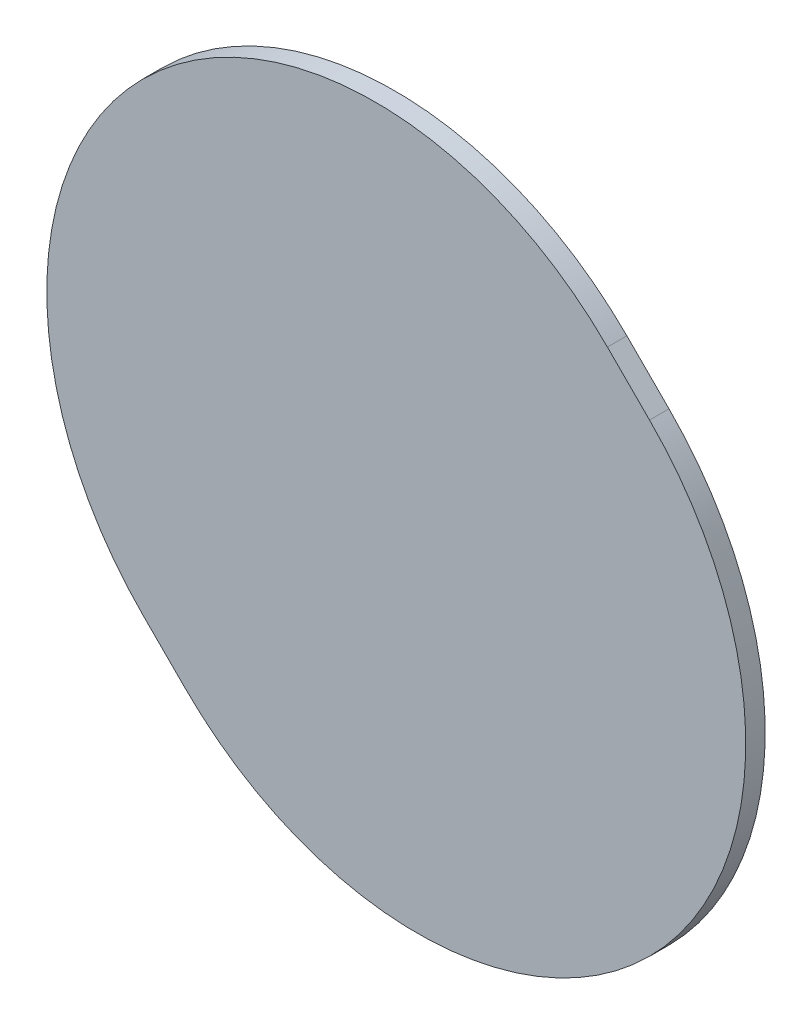
ISO-10303-21;
HEADER;
FILE_DESCRIPTION(('STEP AP214'),'2;1');
FILE_NAME('part.step','',(''),(''),'','','');
FILE_SCHEMA(('AUTOMOTIVE_DESIGN { 1 0 10303 214 1 1 1 1 }'));
ENDSEC;
DATA;
#1=APPLICATION_CONTEXT('core data for automotive mechanical design processes');
#2=APPLICATION_PROTOCOL_DEFINITION('international standard','automotive_design',2000,#1);
#3=PRODUCT_CONTEXT('',#1,'mechanical');
#4=PRODUCT('Part','Part','',(#3));
#5=PRODUCT_RELATED_PRODUCT_CATEGORY('part','',(#4));
#6=PRODUCT_DEFINITION_FORMATION('','',#4);
#7=PRODUCT_DEFINITION_CONTEXT('part definition',#1,'design');
#8=PRODUCT_DEFINITION('design','',#6,#7);
#9=PRODUCT_DEFINITION_SHAPE('','',#8);
#10=(LENGTH_UNIT() NAMED_UNIT(*) SI_UNIT(.MILLI.,.METRE.));
#11=(NAMED_UNIT(*) PLANE_ANGLE_UNIT() SI_UNIT($,.RADIAN.));
#12=(NAMED_UNIT(*) SI_UNIT($,.STERADIAN.) SOLID_ANGLE_UNIT());
#13=UNCERTAINTY_MEASURE_WITH_UNIT(LENGTH_MEASURE(1.E-05),#10,'distance_accuracy_value','');
#14=(GEOMETRIC_REPRESENTATION_CONTEXT(3) GLOBAL_UNCERTAINTY_ASSIGNED_CONTEXT((#13)) GLOBAL_UNIT_ASSIGNED_CONTEXT((#10,
#11,#12)) REPRESENTATION_CONTEXT('',''));
#15=CARTESIAN_POINT('',(0.,0.,0.));
#16=DIRECTION('',(0.,0.,1.));
#17=DIRECTION('',(1.,0.,0.));
#18=AXIS2_PLACEMENT_3D('',#15,#16,#17);
#19=CARTESIAN_POINT('',(85.20873992,114.10875578,0.));
#20=DIRECTION('',(0.707106781186613,0.707106781186482,0.));
#21=DIRECTION('',(0.707106781186482,-0.707106781186613,0.));
#22=AXIS2_PLACEMENT_3D('',#19,#20,#21);
#23=PLANE('',#22);
#24=DIRECTION('',(0.707106781186482,-0.707106781186613,0.));
#25=VECTOR('',#24,1.);
#26=CARTESIAN_POINT('',(85.20873992,114.10875578,0.03556));
#27=LINE('',#26,#25);
#28=CARTESIAN_POINT('',(85.20873992,114.10875578,0.03556));
#29=VERTEX_POINT('',#28);
#30=CARTESIAN_POINT('',(85.28575018,114.03174552,0.03556));
#31=VERTEX_POINT('',#30);
#32=EDGE_CURVE('E11',#29,#31,#27,.T.);
#33=ORIENTED_EDGE('',*,*,#32,.F.);
#34=DIRECTION('',(0.,0.,1.));
#35=VECTOR('',#34,1.);
#36=CARTESIAN_POINT('',(85.20873992,114.10875578,0.));
#37=LINE('',#36,#35);
#38=CARTESIAN_POINT('',(85.20873992,114.10875578,0.));
#39=VERTEX_POINT('',#38);
#40=EDGE_CURVE('E24',#39,#29,#37,.T.);
#41=ORIENTED_EDGE('',*,*,#40,.F.);
#42=DIRECTION('',(0.707106781186482,-0.707106781186613,0.));
#43=VECTOR('',#42,1.);
#44=CARTESIAN_POINT('',(85.20873992,114.10875578,0.));
#45=LINE('',#44,#43);
#46=CARTESIAN_POINT('',(85.28575018,114.03174552,0.));
#47=VERTEX_POINT('',#46);
#48=EDGE_CURVE('E75',#39,#47,#45,.T.);
#49=ORIENTED_EDGE('',*,*,#48,.T.);
#50=DIRECTION('',(0.,0.,1.));
#51=VECTOR('',#50,1.);
#52=CARTESIAN_POINT('',(85.28575018,114.03174552,0.));
#53=LINE('',#52,#51);
#54=EDGE_CURVE('E37',#47,#31,#53,.T.);
#55=ORIENTED_EDGE('',*,*,#54,.T.);
#56=EDGE_LOOP('',(#33,#41,#49,#55));
#57=FACE_BOUND('',#56,.T.);
#58=ADVANCED_FACE('F17',(#57),#23,.F.);
#59=CARTESIAN_POINT('',(85.71001273,114.45600807,0.));
#60=DIRECTION('',(0.,0.,-1.));
#61=DIRECTION('',(-0.707106781186548,-0.707106781186548,0.));
#62=AXIS2_PLACEMENT_3D('',#59,#60,#61);
#63=CYLINDRICAL_SURFACE('',#62,0.599997852216992);
#64=CARTESIAN_POINT('',(85.71001273,114.45600807,0.03556));
#65=DIRECTION('',(0.,0.,1.));
#66=DIRECTION('',(-0.707106781186548,-0.707106781186548,0.));
#67=AXIS2_PLACEMENT_3D('',#64,#65,#66);
#68=CIRCLE('',#67,0.599997852216992);
#69=CARTESIAN_POINT('',(86.13427528,114.88027062,0.03556));
#70=VERTEX_POINT('',#69);
#71=EDGE_CURVE('E83',#31,#70,#68,.T.);
#72=ORIENTED_EDGE('',*,*,#71,.F.);
#73=ORIENTED_EDGE('',*,*,#54,.F.);
#74=CARTESIAN_POINT('',(85.71001273,114.45600807,0.));
#75=DIRECTION('',(0.,0.,1.));
#76=DIRECTION('',(-0.707106781186548,-0.707106781186548,0.));
#77=AXIS2_PLACEMENT_3D('',#74,#75,#76);
#78=CIRCLE('',#77,0.599997852216992);
#79=CARTESIAN_POINT('',(86.13427528,114.88027062,0.));
#80=VERTEX_POINT('',#79);
#81=EDGE_CURVE('E81',#47,#80,#78,.T.);
#82=ORIENTED_EDGE('',*,*,#81,.T.);
#83=DIRECTION('',(0.,0.,1.));
#84=VECTOR('',#83,1.);
#85=CARTESIAN_POINT('',(86.13427528,114.88027062,0.));
#86=LINE('',#85,#84);
#87=EDGE_CURVE('E67',#80,#70,#86,.T.);
#88=ORIENTED_EDGE('',*,*,#87,.T.);
#89=EDGE_LOOP('',(#72,#73,#82,#88));
#90=FACE_BOUND('',#89,.T.);
#91=ADVANCED_FACE('F89',(#90),#63,.T.);
#92=CARTESIAN_POINT('',(86.13427528,114.88027062,0.));
#93=DIRECTION('',(-0.707106781186548,-0.707106781186548,0.));
#94=DIRECTION('',(-0.707106781186548,0.707106781186548,0.));
#95=AXIS2_PLACEMENT_3D('',#92,#93,#94);
#96=PLANE('',#95);
#97=DIRECTION('',(-0.707106781186548,0.707106781186548,0.));
#98=VECTOR('',#97,1.);
#99=CARTESIAN_POINT('',(86.13427528,114.88027062,0.03556));
#100=LINE('',#99,#98);
#101=CARTESIAN_POINT('',(86.05726502,114.95728088,0.03556));
#102=VERTEX_POINT('',#101);
#103=EDGE_CURVE('E71',#70,#102,#100,.T.);
#104=ORIENTED_EDGE('',*,*,#103,.F.);
#105=ORIENTED_EDGE('',*,*,#87,.F.);
#106=DIRECTION('',(-0.707106781186548,0.707106781186548,0.));
#107=VECTOR('',#106,1.);
#108=CARTESIAN_POINT('',(86.13427528,114.88027062,0.));
#109=LINE('',#108,#107);
#110=CARTESIAN_POINT('',(86.05726502,114.95728088,0.));
#111=VERTEX_POINT('',#110);
#112=EDGE_CURVE('E63',#80,#111,#109,.T.);
#113=ORIENTED_EDGE('',*,*,#112,.T.);
#114=DIRECTION('',(0.,0.,1.));
#115=VECTOR('',#114,1.);
#116=CARTESIAN_POINT('',(86.05726502,114.95728088,0.));
#117=LINE('',#116,#115);
#118=EDGE_CURVE('E53',#111,#102,#117,.T.);
#119=ORIENTED_EDGE('',*,*,#118,.T.);
#120=EDGE_LOOP('',(#104,#105,#113,#119));
#121=FACE_BOUND('',#120,.T.);
#122=ADVANCED_FACE('F66',(#121),#96,.F.);
#123=CARTESIAN_POINT('',(85.63300247,114.53301833,0.));
#124=DIRECTION('',(0.,0.,-1.));
#125=DIRECTION('',(0.707106781186548,0.707106781186548,0.));
#126=AXIS2_PLACEMENT_3D('',#123,#124,#125);
#127=CYLINDRICAL_SURFACE('',#126,0.599997852216986);
#128=CARTESIAN_POINT('',(85.63300247,114.53301833,0.03556));
#129=DIRECTION('',(0.,0.,1.));
#130=DIRECTION('',(0.707106781186548,0.707106781186548,0.));
#131=AXIS2_PLACEMENT_3D('',#128,#129,#130);
#132=CIRCLE('',#131,0.599997852216986);
#133=EDGE_CURVE('E59',#102,#29,#132,.T.);
#134=ORIENTED_EDGE('',*,*,#133,.F.);
#135=ORIENTED_EDGE('',*,*,#118,.F.);
#136=CARTESIAN_POINT('',(85.63300247,114.53301833,0.));
#137=DIRECTION('',(0.,0.,1.));
#138=DIRECTION('',(0.707106781186548,0.707106781186548,0.));
#139=AXIS2_PLACEMENT_3D('',#136,#137,#138);
#140=CIRCLE('',#139,0.599997852216986);
#141=EDGE_CURVE('E57',#111,#39,#140,.T.);
#142=ORIENTED_EDGE('',*,*,#141,.T.);
#143=ORIENTED_EDGE('',*,*,#40,.T.);
#144=EDGE_LOOP('',(#134,#135,#142,#143));
#145=FACE_BOUND('',#144,.T.);
#146=ADVANCED_FACE('F55',(#145),#127,.T.);
#147=CARTESIAN_POINT('',(85.20873992,114.10875578,0.));
#148=DIRECTION('',(0.,0.,-1.));
#149=DIRECTION('',(-1.,0.,0.));
#150=AXIS2_PLACEMENT_3D('',#147,#148,#149);
#151=PLANE('',#150);
#152=ORIENTED_EDGE('',*,*,#141,.F.);
#153=ORIENTED_EDGE('',*,*,#112,.F.);
#154=ORIENTED_EDGE('',*,*,#81,.F.);
#155=ORIENTED_EDGE('',*,*,#48,.F.);
#156=EDGE_LOOP('',(#152,#153,#154,#155));
#157=FACE_BOUND('',#156,.T.);
#158=ADVANCED_FACE('F74',(#157),#151,.T.);
#159=CARTESIAN_POINT('',(85.20873992,114.10875578,0.03556));
#160=DIRECTION('',(0.,0.,-1.));
#161=DIRECTION('',(-1.,0.,0.));
#162=AXIS2_PLACEMENT_3D('',#159,#160,#161);
#163=PLANE('',#162);
#164=ORIENTED_EDGE('',*,*,#32,.T.);
#165=ORIENTED_EDGE('',*,*,#71,.T.);
#166=ORIENTED_EDGE('',*,*,#103,.T.);
#167=ORIENTED_EDGE('',*,*,#133,.T.);
#168=EDGE_LOOP('',(#164,#165,#166,#167));
#169=FACE_BOUND('',#168,.T.);
#170=ADVANCED_FACE('F91',(#169),#163,.F.);
#171=CLOSED_SHELL('',(#58,#91,#122,#146,#158,#170));
#172=MANIFOLD_SOLID_BREP('B1',#171);
#173=ADVANCED_BREP_SHAPE_REPRESENTATION('',(#18,#172),#14);
#174=SHAPE_DEFINITION_REPRESENTATION(#9,#173);
ENDSEC;
END-ISO-10303-21;
